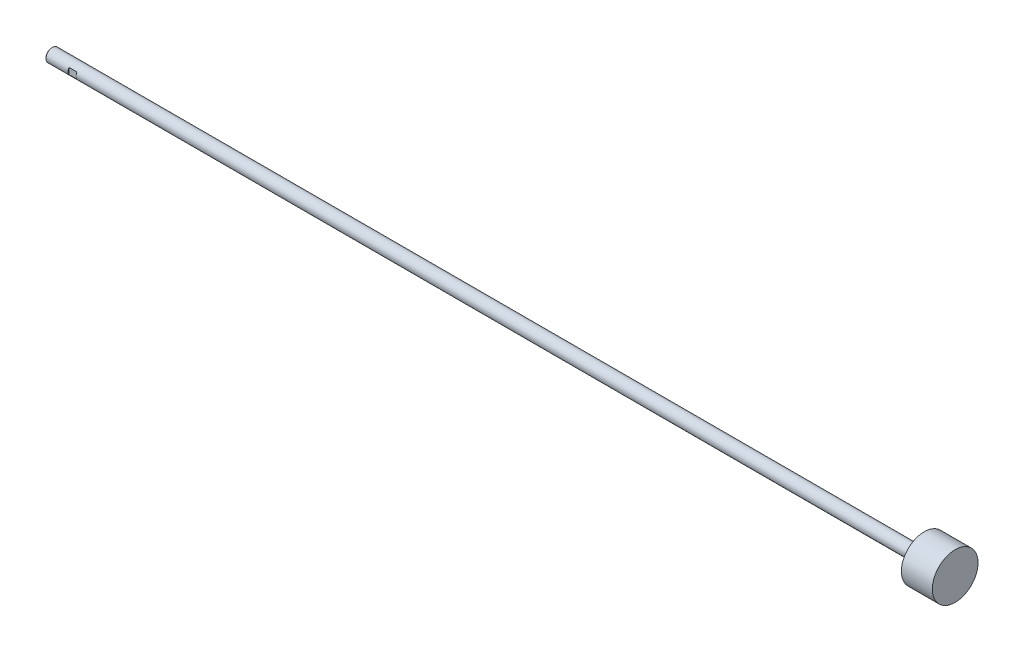
ISO-10303-21;
HEADER;
FILE_DESCRIPTION(('STEP AP214'),'2;1');
FILE_NAME('part.step','',(''),(''),'','','');
FILE_SCHEMA(('AUTOMOTIVE_DESIGN { 1 0 10303 214 1 1 1 1 }'));
ENDSEC;
DATA;
#1=APPLICATION_CONTEXT('core data for automotive mechanical design processes');
#2=APPLICATION_PROTOCOL_DEFINITION('international standard','automotive_design',2000,#1);
#3=PRODUCT_CONTEXT('',#1,'mechanical');
#4=PRODUCT('Part','Part','',(#3));
#5=PRODUCT_RELATED_PRODUCT_CATEGORY('part','',(#4));
#6=PRODUCT_DEFINITION_FORMATION('','',#4);
#7=PRODUCT_DEFINITION_CONTEXT('part definition',#1,'design');
#8=PRODUCT_DEFINITION('design','',#6,#7);
#9=PRODUCT_DEFINITION_SHAPE('','',#8);
#10=(LENGTH_UNIT() NAMED_UNIT(*) SI_UNIT(.MILLI.,.METRE.));
#11=(NAMED_UNIT(*) PLANE_ANGLE_UNIT() SI_UNIT($,.RADIAN.));
#12=(NAMED_UNIT(*) SI_UNIT($,.STERADIAN.) SOLID_ANGLE_UNIT());
#13=UNCERTAINTY_MEASURE_WITH_UNIT(LENGTH_MEASURE(1.E-05),#10,'distance_accuracy_value','');
#14=(GEOMETRIC_REPRESENTATION_CONTEXT(3) GLOBAL_UNCERTAINTY_ASSIGNED_CONTEXT((#13)) GLOBAL_UNIT_ASSIGNED_CONTEXT((#10,
#11,#12)) REPRESENTATION_CONTEXT('',''));
#15=CARTESIAN_POINT('',(0.,0.,0.));
#16=DIRECTION('',(0.,0.,1.));
#17=DIRECTION('',(1.,0.,0.));
#18=AXIS2_PLACEMENT_3D('',#15,#16,#17);
#19=CARTESIAN_POINT('',(441.3885,22.34565,0.));
#20=DIRECTION('',(-1.,0.,0.));
#21=DIRECTION('',(0.,0.,1.));
#22=AXIS2_PLACEMENT_3D('',#19,#20,#21);
#23=PLANE('',#22);
#24=CARTESIAN_POINT('',(441.3885,0.,0.));
#25=DIRECTION('',(-1.,0.,0.));
#26=DIRECTION('',(0.,0.,1.));
#27=AXIS2_PLACEMENT_3D('',#24,#25,#26);
#28=CIRCLE('',#27,22.34565);
#29=CARTESIAN_POINT('',(441.3885,0.,22.34565));
#30=VERTEX_POINT('',#29);
#31=EDGE_CURVE('E19',#30,#30,#28,.T.);
#32=ORIENTED_EDGE('',*,*,#31,.F.);
#33=EDGE_LOOP('',(#32));
#34=FACE_BOUND('',#33,.T.);
#35=ADVANCED_FACE('F16',(#34),#23,.F.);
#36=CARTESIAN_POINT('',(441.3885,0.,0.));
#37=DIRECTION('',(-1.,0.,0.));
#38=DIRECTION('',(0.,0.,1.));
#39=AXIS2_PLACEMENT_3D('',#36,#37,#38);
#40=CYLINDRICAL_SURFACE('',#39,22.34565);
#41=CARTESIAN_POINT('',(411.1625,0.,0.));
#42=DIRECTION('',(-1.,0.,0.));
#43=DIRECTION('',(0.,0.,1.));
#44=AXIS2_PLACEMENT_3D('',#41,#42,#43);
#45=CIRCLE('',#44,22.34565);
#46=CARTESIAN_POINT('',(411.1625,0.,22.34565));
#47=VERTEX_POINT('',#46);
#48=EDGE_CURVE('E93',#47,#47,#45,.F.);
#49=ORIENTED_EDGE('',*,*,#48,.T.);
#50=EDGE_LOOP('',(#49));
#51=FACE_BOUND('',#50,.T.);
#52=ORIENTED_EDGE('',*,*,#31,.T.);
#53=EDGE_LOOP('',(#52));
#54=FACE_BOUND('',#53,.T.);
#55=ADVANCED_FACE('F100',(#51,#54),#40,.T.);
#56=CARTESIAN_POINT('',(-441.3885,0.,0.));
#57=DIRECTION('',(1.,0.,0.));
#58=DIRECTION('',(0.,0.,-1.));
#59=AXIS2_PLACEMENT_3D('',#56,#57,#58);
#60=PLANE('',#59);
#61=CARTESIAN_POINT('',(-441.388500000073,0.,0.));
#62=DIRECTION('',(1.,0.,0.));
#63=DIRECTION('',(0.,0.,-1.));
#64=AXIS2_PLACEMENT_3D('',#61,#62,#63);
#65=CIRCLE('',#64,5.59435000008079);
#66=CARTESIAN_POINT('',(-441.388500000073,0.,-5.59435000008079));
#67=VERTEX_POINT('',#66);
#68=EDGE_CURVE('E74',#67,#67,#65,.T.);
#69=ORIENTED_EDGE('',*,*,#68,.F.);
#70=EDGE_LOOP('',(#69));
#71=FACE_BOUND('',#70,.T.);
#72=ADVANCED_FACE('F107',(#71),#60,.F.);
#73=CARTESIAN_POINT('',(411.1625,6.35,0.));
#74=DIRECTION('',(1.,0.,0.));
#75=DIRECTION('',(0.,0.,-1.));
#76=AXIS2_PLACEMENT_3D('',#73,#74,#75);
#77=PLANE('',#76);
#78=CARTESIAN_POINT('',(411.1625,0.,0.));
#79=DIRECTION('',(-1.,0.,0.));
#80=DIRECTION('',(0.,0.,1.));
#81=AXIS2_PLACEMENT_3D('',#78,#79,#80);
#82=CIRCLE('',#81,6.35);
#83=CARTESIAN_POINT('',(411.1625,0.,6.35));
#84=VERTEX_POINT('',#83);
#85=EDGE_CURVE('E91',#84,#84,#82,.T.);
#86=ORIENTED_EDGE('',*,*,#85,.F.);
#87=EDGE_LOOP('',(#86));
#88=FACE_BOUND('',#87,.T.);
#89=ORIENTED_EDGE('',*,*,#48,.F.);
#90=EDGE_LOOP('',(#89));
#91=FACE_BOUND('',#90,.T.);
#92=ADVANCED_FACE('F136',(#88,#91),#77,.F.);
#93=CARTESIAN_POINT('',(-411.1625,0.,0.));
#94=DIRECTION('',(1.,0.,0.));
#95=DIRECTION('',(0.,0.,-1.));
#96=AXIS2_PLACEMENT_3D('',#93,#94,#95);
#97=PLANE('',#96);
#98=CARTESIAN_POINT('',(-411.1625,0.,0.));
#99=DIRECTION('',(-1.,0.,0.));
#100=DIRECTION('',(0.,0.,1.));
#101=AXIS2_PLACEMENT_3D('',#98,#99,#100);
#102=CIRCLE('',#101,6.35);
#103=CARTESIAN_POINT('',(-411.1625,3.01608289010763,5.588));
#104=VERTEX_POINT('',#103);
#105=CARTESIAN_POINT('',(-411.1625,-3.01608289010763,5.588));
#106=VERTEX_POINT('',#105);
#107=EDGE_CURVE('E53',#104,#106,#102,.F.);
#108=ORIENTED_EDGE('',*,*,#107,.F.);
#109=DIRECTION('',(0.,1.,0.));
#110=VECTOR('',#109,1.);
#111=CARTESIAN_POINT('',(-411.1625,6.35,5.588));
#112=LINE('',#111,#110);
#113=EDGE_CURVE('E75',#104,#106,#112,.F.);
#114=ORIENTED_EDGE('',*,*,#113,.T.);
#115=EDGE_LOOP('',(#108,#114));
#116=FACE_BOUND('',#115,.T.);
#117=ADVANCED_FACE('F133',(#116),#97,.F.);
#118=CARTESIAN_POINT('',(-411.1625,6.35,5.588));
#119=DIRECTION('',(0.,0.,-1.));
#120=DIRECTION('',(-1.,0.,0.));
#121=AXIS2_PLACEMENT_3D('',#118,#119,#120);
#122=PLANE('',#121);
#123=DIRECTION('',(-1.,0.,0.));
#124=VECTOR('',#123,1.);
#125=CARTESIAN_POINT('',(441.3885,-3.01608289010763,5.588));
#126=LINE('',#125,#124);
#127=CARTESIAN_POINT('',(-419.0365,-3.01608289010763,5.588));
#128=VERTEX_POINT('',#127);
#129=EDGE_CURVE('E67',#106,#128,#126,.T.);
#130=ORIENTED_EDGE('',*,*,#129,.F.);
#131=ORIENTED_EDGE('',*,*,#113,.F.);
#132=DIRECTION('',(-1.,0.,0.));
#133=VECTOR('',#132,1.);
#134=CARTESIAN_POINT('',(441.3885,3.01608289010763,5.588));
#135=LINE('',#134,#133);
#136=CARTESIAN_POINT('',(-419.0365,3.01608289010763,5.588));
#137=VERTEX_POINT('',#136);
#138=EDGE_CURVE('E65',#137,#104,#135,.F.);
#139=ORIENTED_EDGE('',*,*,#138,.F.);
#140=DIRECTION('',(0.,1.,0.));
#141=VECTOR('',#140,1.);
#142=CARTESIAN_POINT('',(-419.0365,0.,5.588));
#143=LINE('',#142,#141);
#144=EDGE_CURVE('E71',#128,#137,#143,.T.);
#145=ORIENTED_EDGE('',*,*,#144,.F.);
#146=EDGE_LOOP('',(#130,#131,#139,#145));
#147=FACE_BOUND('',#146,.T.);
#148=ADVANCED_FACE('F77',(#147),#122,.F.);
#149=CARTESIAN_POINT('',(-419.0365,0.,0.));
#150=DIRECTION('',(1.,0.,0.));
#151=DIRECTION('',(0.,0.,-1.));
#152=AXIS2_PLACEMENT_3D('',#149,#150,#151);
#153=PLANE('',#152);
#154=CARTESIAN_POINT('',(-419.0365,0.,0.));
#155=DIRECTION('',(-1.,0.,0.));
#156=DIRECTION('',(0.,0.,1.));
#157=AXIS2_PLACEMENT_3D('',#154,#155,#156);
#158=CIRCLE('',#157,6.35);
#159=EDGE_CURVE('E60',#128,#137,#158,.T.);
#160=ORIENTED_EDGE('',*,*,#159,.F.);
#161=ORIENTED_EDGE('',*,*,#144,.T.);
#162=EDGE_LOOP('',(#160,#161));
#163=FACE_BOUND('',#162,.T.);
#164=ADVANCED_FACE('F72',(#163),#153,.T.);
#165=CARTESIAN_POINT('',(-440.632850000043,0.,0.));
#166=DIRECTION('',(1.,0.,0.));
#167=DIRECTION('',(0.,0.,-1.));
#168=AXIS2_PLACEMENT_3D('',#165,#166,#167);
#169=CONICAL_SURFACE('',#168,6.35000000011132,0.785398163397448);
#170=CARTESIAN_POINT('',(-440.63285,0.,0.));
#171=DIRECTION('',(-1.,0.,0.));
#172=DIRECTION('',(0.,0.,1.));
#173=AXIS2_PLACEMENT_3D('',#170,#171,#172);
#174=CIRCLE('',#173,6.35);
#175=CARTESIAN_POINT('',(-440.63285,0.,6.35));
#176=VERTEX_POINT('',#175);
#177=EDGE_CURVE('E69',#176,#176,#174,.F.);
#178=ORIENTED_EDGE('',*,*,#177,.F.);
#179=EDGE_LOOP('',(#178));
#180=FACE_BOUND('',#179,.T.);
#181=ORIENTED_EDGE('',*,*,#68,.T.);
#182=EDGE_LOOP('',(#181));
#183=FACE_BOUND('',#182,.T.);
#184=ADVANCED_FACE('F124',(#180,#183),#169,.T.);
#185=CARTESIAN_POINT('',(-419.0365,0.,0.));
#186=DIRECTION('',(1.,0.,0.));
#187=DIRECTION('',(0.,0.,-1.));
#188=AXIS2_PLACEMENT_3D('',#185,#186,#187);
#189=PLANE('',#188);
#190=CARTESIAN_POINT('',(-419.0365,0.,0.));
#191=DIRECTION('',(-1.,0.,0.));
#192=DIRECTION('',(0.,0.,1.));
#193=AXIS2_PLACEMENT_3D('',#190,#191,#192);
#194=CIRCLE('',#193,6.35);
#195=CARTESIAN_POINT('',(-419.0365,3.01608289010763,-5.588));
#196=VERTEX_POINT('',#195);
#197=CARTESIAN_POINT('',(-419.0365,-3.01608289010763,-5.588));
#198=VERTEX_POINT('',#197);
#199=EDGE_CURVE('E87',#196,#198,#194,.T.);
#200=ORIENTED_EDGE('',*,*,#199,.F.);
#201=DIRECTION('',(0.,1.,0.));
#202=VECTOR('',#201,1.);
#203=CARTESIAN_POINT('',(-419.0365,-6.35,-5.588));
#204=LINE('',#203,#202);
#205=EDGE_CURVE('E81',#196,#198,#204,.F.);
#206=ORIENTED_EDGE('',*,*,#205,.T.);
#207=EDGE_LOOP('',(#200,#206));
#208=FACE_BOUND('',#207,.T.);
#209=ADVANCED_FACE('F121',(#208),#189,.T.);
#210=CARTESIAN_POINT('',(-411.1625,-6.35,-5.588));
#211=DIRECTION('',(0.,0.,1.));
#212=DIRECTION('',(1.,0.,0.));
#213=AXIS2_PLACEMENT_3D('',#210,#211,#212);
#214=PLANE('',#213);
#215=DIRECTION('',(1.,0.,0.));
#216=VECTOR('',#215,1.);
#217=CARTESIAN_POINT('',(-411.1625,3.01608289010763,-5.588));
#218=LINE('',#217,#216);
#219=CARTESIAN_POINT('',(-411.1625,3.01608289010763,-5.588));
#220=VERTEX_POINT('',#219);
#221=EDGE_CURVE('E78',#220,#196,#218,.F.);
#222=ORIENTED_EDGE('',*,*,#221,.F.);
#223=DIRECTION('',(0.,1.,0.));
#224=VECTOR('',#223,1.);
#225=CARTESIAN_POINT('',(-411.1625,0.,-5.588));
#226=LINE('',#225,#224);
#227=CARTESIAN_POINT('',(-411.1625,-3.01608289010763,-5.588));
#228=VERTEX_POINT('',#227);
#229=EDGE_CURVE('E34',#220,#228,#226,.F.);
#230=ORIENTED_EDGE('',*,*,#229,.T.);
#231=DIRECTION('',(-1.,0.,0.));
#232=VECTOR('',#231,1.);
#233=CARTESIAN_POINT('',(441.3885,-3.01608289010763,-5.588));
#234=LINE('',#233,#232);
#235=EDGE_CURVE('E25',#198,#228,#234,.F.);
#236=ORIENTED_EDGE('',*,*,#235,.F.);
#237=ORIENTED_EDGE('',*,*,#205,.F.);
#238=EDGE_LOOP('',(#222,#230,#236,#237));
#239=FACE_BOUND('',#238,.T.);
#240=ADVANCED_FACE('F115',(#239),#214,.F.);
#241=CARTESIAN_POINT('',(-411.1625,0.,0.));
#242=DIRECTION('',(1.,0.,0.));
#243=DIRECTION('',(0.,0.,-1.));
#244=AXIS2_PLACEMENT_3D('',#241,#242,#243);
#245=PLANE('',#244);
#246=ORIENTED_EDGE('',*,*,#229,.F.);
#247=CARTESIAN_POINT('',(-411.1625,0.,0.));
#248=DIRECTION('',(-1.,0.,0.));
#249=DIRECTION('',(0.,0.,1.));
#250=AXIS2_PLACEMENT_3D('',#247,#248,#249);
#251=CIRCLE('',#250,6.35);
#252=EDGE_CURVE('E10',#228,#220,#251,.F.);
#253=ORIENTED_EDGE('',*,*,#252,.F.);
#254=EDGE_LOOP('',(#246,#253));
#255=FACE_BOUND('',#254,.T.);
#256=ADVANCED_FACE('F109',(#255),#245,.F.);
#257=CARTESIAN_POINT('',(441.3885,0.,0.));
#258=DIRECTION('',(-1.,0.,0.));
#259=DIRECTION('',(0.,0.,1.));
#260=AXIS2_PLACEMENT_3D('',#257,#258,#259);
#261=CYLINDRICAL_SURFACE('',#260,6.35);
#262=ORIENTED_EDGE('',*,*,#85,.T.);
#263=EDGE_LOOP('',(#262));
#264=FACE_BOUND('',#263,.T.);
#265=ORIENTED_EDGE('',*,*,#138,.T.);
#266=ORIENTED_EDGE('',*,*,#107,.T.);
#267=ORIENTED_EDGE('',*,*,#129,.T.);
#268=ORIENTED_EDGE('',*,*,#159,.T.);
#269=EDGE_LOOP('',(#265,#266,#267,#268));
#270=FACE_BOUND('',#269,.T.);
#271=ORIENTED_EDGE('',*,*,#177,.T.);
#272=EDGE_LOOP('',(#271));
#273=FACE_BOUND('',#272,.T.);
#274=ORIENTED_EDGE('',*,*,#235,.T.);
#275=ORIENTED_EDGE('',*,*,#252,.T.);
#276=ORIENTED_EDGE('',*,*,#221,.T.);
#277=ORIENTED_EDGE('',*,*,#199,.T.);
#278=EDGE_LOOP('',(#274,#275,#276,#277));
#279=FACE_BOUND('',#278,.T.);
#280=ADVANCED_FACE('F62',(#264,#270,#273,#279),#261,.T.);
#281=CLOSED_SHELL('',(#35,#55,#72,#92,#117,#148,#164,#184,#209,#240,#256,#280));
#282=MANIFOLD_SOLID_BREP('B1',#281);
#283=ADVANCED_BREP_SHAPE_REPRESENTATION('',(#18,#282),#14);
#284=SHAPE_DEFINITION_REPRESENTATION(#9,#283);
ENDSEC;
END-ISO-10303-21;
